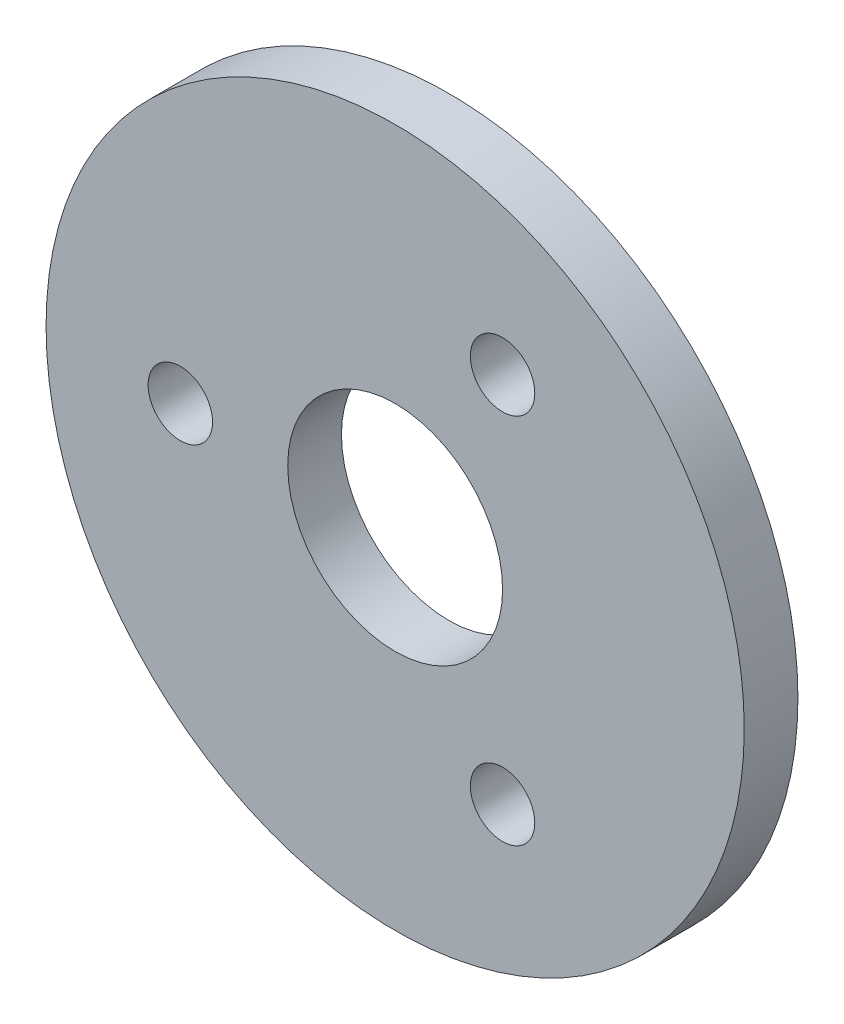
ISO-10303-21;
HEADER;
FILE_DESCRIPTION(('STEP AP214'),'2;1');
FILE_NAME('part.step','',(''),(''),'','','');
FILE_SCHEMA(('AUTOMOTIVE_DESIGN { 1 0 10303 214 1 1 1 1 }'));
ENDSEC;
DATA;
#1=APPLICATION_CONTEXT('core data for automotive mechanical design processes');
#2=APPLICATION_PROTOCOL_DEFINITION('international standard','automotive_design',2000,#1);
#3=PRODUCT_CONTEXT('',#1,'mechanical');
#4=PRODUCT('Part','Part','',(#3));
#5=PRODUCT_RELATED_PRODUCT_CATEGORY('part','',(#4));
#6=PRODUCT_DEFINITION_FORMATION('','',#4);
#7=PRODUCT_DEFINITION_CONTEXT('part definition',#1,'design');
#8=PRODUCT_DEFINITION('design','',#6,#7);
#9=PRODUCT_DEFINITION_SHAPE('','',#8);
#10=(LENGTH_UNIT() NAMED_UNIT(*) SI_UNIT(.MILLI.,.METRE.));
#11=(NAMED_UNIT(*) PLANE_ANGLE_UNIT() SI_UNIT($,.RADIAN.));
#12=(NAMED_UNIT(*) SI_UNIT($,.STERADIAN.) SOLID_ANGLE_UNIT());
#13=UNCERTAINTY_MEASURE_WITH_UNIT(LENGTH_MEASURE(1.E-05),#10,'distance_accuracy_value','');
#14=(GEOMETRIC_REPRESENTATION_CONTEXT(3) GLOBAL_UNCERTAINTY_ASSIGNED_CONTEXT((#13)) GLOBAL_UNIT_ASSIGNED_CONTEXT((#10,
#11,#12)) REPRESENTATION_CONTEXT('',''));
#15=CARTESIAN_POINT('',(0.,0.,0.));
#16=DIRECTION('',(0.,0.,1.));
#17=DIRECTION('',(1.,0.,0.));
#18=AXIS2_PLACEMENT_3D('',#15,#16,#17);
#19=CARTESIAN_POINT('',(0.,0.,2.5));
#20=DIRECTION('',(0.,0.,1.));
#21=DIRECTION('',(1.,0.,0.));
#22=AXIS2_PLACEMENT_3D('',#19,#20,#21);
#23=PLANE('',#22);
#24=CARTESIAN_POINT('',(9.99999999999926,17.3205080756901,2.5));
#25=DIRECTION('',(0.,0.,1.));
#26=DIRECTION('',(1.,0.,0.));
#27=AXIS2_PLACEMENT_3D('',#24,#25,#26);
#28=CIRCLE('',#27,3.00000000000109);
#29=CARTESIAN_POINT('',(13.0000000000004,17.3205080756901,2.5));
#30=VERTEX_POINT('',#29);
#31=EDGE_CURVE('E59',#30,#30,#28,.T.);
#32=ORIENTED_EDGE('',*,*,#31,.F.);
#33=EDGE_LOOP('',(#32));
#34=FACE_BOUND('',#33,.T.);
#35=CARTESIAN_POINT('',(0.,0.,2.5));
#36=DIRECTION('',(0.,0.,1.));
#37=DIRECTION('',(1.,0.,0.));
#38=AXIS2_PLACEMENT_3D('',#35,#36,#37);
#39=CIRCLE('',#38,10.);
#40=CARTESIAN_POINT('',(10.,0.,2.5));
#41=VERTEX_POINT('',#40);
#42=EDGE_CURVE('E48',#41,#41,#39,.T.);
#43=ORIENTED_EDGE('',*,*,#42,.F.);
#44=EDGE_LOOP('',(#43));
#45=FACE_BOUND('',#44,.T.);
#46=CARTESIAN_POINT('',(0.,0.,2.5));
#47=DIRECTION('',(0.,0.,1.));
#48=DIRECTION('',(1.,0.,0.));
#49=AXIS2_PLACEMENT_3D('',#46,#47,#48);
#50=CIRCLE('',#49,32.5);
#51=CARTESIAN_POINT('',(32.5,0.,2.5));
#52=VERTEX_POINT('',#51);
#53=EDGE_CURVE('E10',#52,#52,#50,.T.);
#54=ORIENTED_EDGE('',*,*,#53,.T.);
#55=EDGE_LOOP('',(#54));
#56=FACE_BOUND('',#55,.T.);
#57=CARTESIAN_POINT('',(-20.,0.,2.5));
#58=DIRECTION('',(0.,0.,1.));
#59=DIRECTION('',(1.,0.,0.));
#60=AXIS2_PLACEMENT_3D('',#57,#58,#59);
#61=CIRCLE('',#60,3.);
#62=CARTESIAN_POINT('',(-17.,0.,2.5));
#63=VERTEX_POINT('',#62);
#64=EDGE_CURVE('E53',#63,#63,#61,.T.);
#65=ORIENTED_EDGE('',*,*,#64,.F.);
#66=EDGE_LOOP('',(#65));
#67=FACE_BOUND('',#66,.T.);
#68=CARTESIAN_POINT('',(10.0000000000007,-17.3205080756875,2.5));
#69=DIRECTION('',(0.,0.,1.));
#70=DIRECTION('',(1.,0.,0.));
#71=AXIS2_PLACEMENT_3D('',#68,#69,#70);
#72=CIRCLE('',#71,3.0000000000016);
#73=CARTESIAN_POINT('',(13.0000000000023,-17.3205080756875,2.5));
#74=VERTEX_POINT('',#73);
#75=EDGE_CURVE('E65',#74,#74,#72,.T.);
#76=ORIENTED_EDGE('',*,*,#75,.F.);
#77=EDGE_LOOP('',(#76));
#78=FACE_BOUND('',#77,.T.);
#79=ADVANCED_FACE('F37',(#34,#45,#56,#67,#78),#23,.T.);
#80=CARTESIAN_POINT('',(0.,0.,-2.5));
#81=DIRECTION('',(0.,0.,1.));
#82=DIRECTION('',(1.,0.,0.));
#83=AXIS2_PLACEMENT_3D('',#80,#81,#82);
#84=PLANE('',#83);
#85=CARTESIAN_POINT('',(0.,0.,-2.5));
#86=DIRECTION('',(0.,0.,1.));
#87=DIRECTION('',(1.,0.,0.));
#88=AXIS2_PLACEMENT_3D('',#85,#86,#87);
#89=CIRCLE('',#88,32.5);
#90=CARTESIAN_POINT('',(32.5,0.,-2.5));
#91=VERTEX_POINT('',#90);
#92=EDGE_CURVE('E41',#91,#91,#89,.T.);
#93=ORIENTED_EDGE('',*,*,#92,.F.);
#94=EDGE_LOOP('',(#93));
#95=FACE_BOUND('',#94,.T.);
#96=CARTESIAN_POINT('',(0.,0.,-2.5));
#97=DIRECTION('',(0.,0.,1.));
#98=DIRECTION('',(1.,0.,0.));
#99=AXIS2_PLACEMENT_3D('',#96,#97,#98);
#100=CIRCLE('',#99,10.);
#101=CARTESIAN_POINT('',(10.,0.,-2.5));
#102=VERTEX_POINT('',#101);
#103=EDGE_CURVE('E50',#102,#102,#100,.T.);
#104=ORIENTED_EDGE('',*,*,#103,.T.);
#105=EDGE_LOOP('',(#104));
#106=FACE_BOUND('',#105,.T.);
#107=CARTESIAN_POINT('',(-20.,0.,-2.5));
#108=DIRECTION('',(0.,0.,1.));
#109=DIRECTION('',(1.,0.,0.));
#110=AXIS2_PLACEMENT_3D('',#107,#108,#109);
#111=CIRCLE('',#110,3.);
#112=CARTESIAN_POINT('',(-17.,0.,-2.5));
#113=VERTEX_POINT('',#112);
#114=EDGE_CURVE('E56',#113,#113,#111,.T.);
#115=ORIENTED_EDGE('',*,*,#114,.T.);
#116=EDGE_LOOP('',(#115));
#117=FACE_BOUND('',#116,.T.);
#118=CARTESIAN_POINT('',(9.99999999999926,17.3205080756901,-2.5));
#119=DIRECTION('',(0.,0.,1.));
#120=DIRECTION('',(1.,0.,0.));
#121=AXIS2_PLACEMENT_3D('',#118,#119,#120);
#122=CIRCLE('',#121,3.00000000000109);
#123=CARTESIAN_POINT('',(13.0000000000004,17.3205080756901,-2.5));
#124=VERTEX_POINT('',#123);
#125=EDGE_CURVE('E62',#124,#124,#122,.T.);
#126=ORIENTED_EDGE('',*,*,#125,.T.);
#127=EDGE_LOOP('',(#126));
#128=FACE_BOUND('',#127,.T.);
#129=CARTESIAN_POINT('',(10.0000000000007,-17.3205080756875,-2.5));
#130=DIRECTION('',(0.,0.,1.));
#131=DIRECTION('',(1.,0.,0.));
#132=AXIS2_PLACEMENT_3D('',#129,#130,#131);
#133=CIRCLE('',#132,3.0000000000016);
#134=CARTESIAN_POINT('',(13.0000000000023,-17.3205080756875,-2.5));
#135=VERTEX_POINT('',#134);
#136=EDGE_CURVE('E68',#135,#135,#133,.T.);
#137=ORIENTED_EDGE('',*,*,#136,.T.);
#138=EDGE_LOOP('',(#137));
#139=FACE_BOUND('',#138,.T.);
#140=ADVANCED_FACE('F78',(#95,#106,#117,#128,#139),#84,.F.);
#141=CARTESIAN_POINT('',(0.,0.,2.5));
#142=DIRECTION('',(0.,0.,-1.));
#143=DIRECTION('',(-1.,0.,0.));
#144=AXIS2_PLACEMENT_3D('',#141,#142,#143);
#145=CYLINDRICAL_SURFACE('',#144,32.5);
#146=ORIENTED_EDGE('',*,*,#53,.F.);
#147=EDGE_LOOP('',(#146));
#148=FACE_BOUND('',#147,.T.);
#149=ORIENTED_EDGE('',*,*,#92,.T.);
#150=EDGE_LOOP('',(#149));
#151=FACE_BOUND('',#150,.T.);
#152=ADVANCED_FACE('F39',(#148,#151),#145,.T.);
#153=CARTESIAN_POINT('',(0.,0.,2.5));
#154=DIRECTION('',(0.,0.,-1.));
#155=DIRECTION('',(-1.,0.,0.));
#156=AXIS2_PLACEMENT_3D('',#153,#154,#155);
#157=CYLINDRICAL_SURFACE('',#156,10.);
#158=ORIENTED_EDGE('',*,*,#42,.T.);
#159=EDGE_LOOP('',(#158));
#160=FACE_BOUND('',#159,.T.);
#161=ORIENTED_EDGE('',*,*,#103,.F.);
#162=EDGE_LOOP('',(#161));
#163=FACE_BOUND('',#162,.T.);
#164=ADVANCED_FACE('F88',(#160,#163),#157,.F.);
#165=CARTESIAN_POINT('',(-20.,0.,2.5));
#166=DIRECTION('',(0.,0.,-1.));
#167=DIRECTION('',(-1.,0.,0.));
#168=AXIS2_PLACEMENT_3D('',#165,#166,#167);
#169=CYLINDRICAL_SURFACE('',#168,3.);
#170=ORIENTED_EDGE('',*,*,#64,.T.);
#171=EDGE_LOOP('',(#170));
#172=FACE_BOUND('',#171,.T.);
#173=ORIENTED_EDGE('',*,*,#114,.F.);
#174=EDGE_LOOP('',(#173));
#175=FACE_BOUND('',#174,.T.);
#176=ADVANCED_FACE('F91',(#172,#175),#169,.F.);
#177=CARTESIAN_POINT('',(9.99999999999926,17.3205080756901,2.5));
#178=DIRECTION('',(0.,0.,-1.));
#179=DIRECTION('',(-1.,0.,0.));
#180=AXIS2_PLACEMENT_3D('',#177,#178,#179);
#181=CYLINDRICAL_SURFACE('',#180,3.00000000000109);
#182=ORIENTED_EDGE('',*,*,#31,.T.);
#183=EDGE_LOOP('',(#182));
#184=FACE_BOUND('',#183,.T.);
#185=ORIENTED_EDGE('',*,*,#125,.F.);
#186=EDGE_LOOP('',(#185));
#187=FACE_BOUND('',#186,.T.);
#188=ADVANCED_FACE('F95',(#184,#187),#181,.F.);
#189=CARTESIAN_POINT('',(10.0000000000007,-17.3205080756875,2.5));
#190=DIRECTION('',(0.,0.,-1.));
#191=DIRECTION('',(-1.,0.,0.));
#192=AXIS2_PLACEMENT_3D('',#189,#190,#191);
#193=CYLINDRICAL_SURFACE('',#192,3.0000000000016);
#194=ORIENTED_EDGE('',*,*,#75,.T.);
#195=EDGE_LOOP('',(#194));
#196=FACE_BOUND('',#195,.T.);
#197=ORIENTED_EDGE('',*,*,#136,.F.);
#198=EDGE_LOOP('',(#197));
#199=FACE_BOUND('',#198,.T.);
#200=ADVANCED_FACE('F74',(#196,#199),#193,.F.);
#201=CLOSED_SHELL('',(#79,#140,#152,#164,#176,#188,#200));
#202=MANIFOLD_SOLID_BREP('B2',#201);
#203=ADVANCED_BREP_SHAPE_REPRESENTATION('',(#18,#202),#14);
#204=SHAPE_DEFINITION_REPRESENTATION(#9,#203);
ENDSEC;
END-ISO-10303-21;
